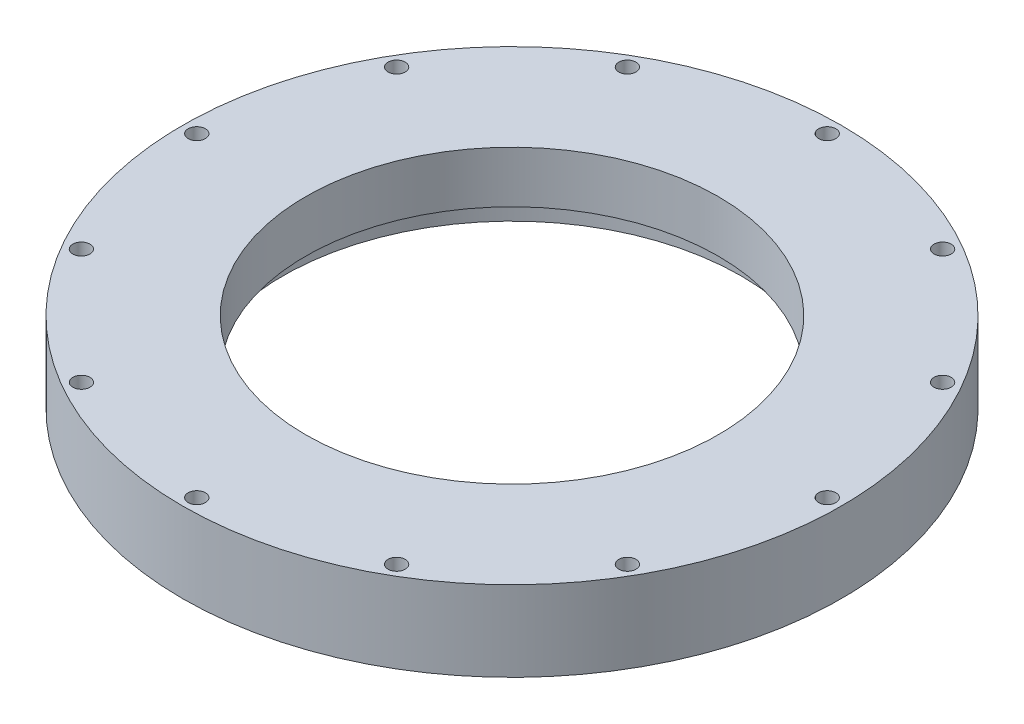
ISO-10303-21;
HEADER;
FILE_DESCRIPTION(('STEP AP214'),'2;1');
FILE_NAME('part.step','',(''),(''),'','','');
FILE_SCHEMA(('AUTOMOTIVE_DESIGN { 1 0 10303 214 1 1 1 1 }'));
ENDSEC;
DATA;
#1=APPLICATION_CONTEXT('core data for automotive mechanical design processes');
#2=APPLICATION_PROTOCOL_DEFINITION('international standard','automotive_design',2000,#1);
#3=PRODUCT_CONTEXT('',#1,'mechanical');
#4=PRODUCT('Part','Part','',(#3));
#5=PRODUCT_RELATED_PRODUCT_CATEGORY('part','',(#4));
#6=PRODUCT_DEFINITION_FORMATION('','',#4);
#7=PRODUCT_DEFINITION_CONTEXT('part definition',#1,'design');
#8=PRODUCT_DEFINITION('design','',#6,#7);
#9=PRODUCT_DEFINITION_SHAPE('','',#8);
#10=(LENGTH_UNIT() NAMED_UNIT(*) SI_UNIT(.MILLI.,.METRE.));
#11=(NAMED_UNIT(*) PLANE_ANGLE_UNIT() SI_UNIT($,.RADIAN.));
#12=(NAMED_UNIT(*) SI_UNIT($,.STERADIAN.) SOLID_ANGLE_UNIT());
#13=UNCERTAINTY_MEASURE_WITH_UNIT(LENGTH_MEASURE(1.E-05),#10,'distance_accuracy_value','');
#14=(GEOMETRIC_REPRESENTATION_CONTEXT(3) GLOBAL_UNCERTAINTY_ASSIGNED_CONTEXT((#13)) GLOBAL_UNIT_ASSIGNED_CONTEXT((#10,
#11,#12)) REPRESENTATION_CONTEXT('',''));
#15=CARTESIAN_POINT('',(0.,0.,0.));
#16=DIRECTION('',(0.,0.,1.));
#17=DIRECTION('',(1.,0.,0.));
#18=AXIS2_PLACEMENT_3D('',#15,#16,#17);
#19=CARTESIAN_POINT('',(0.,14.,0.));
#20=DIRECTION('',(0.,-1.,0.));
#21=DIRECTION('',(0.,0.,-1.));
#22=AXIS2_PLACEMENT_3D('',#19,#20,#21);
#23=CYLINDRICAL_SURFACE('',#22,40.);
#24=CARTESIAN_POINT('',(0.,0.,0.));
#25=DIRECTION('',(0.,1.,0.));
#26=DIRECTION('',(0.,0.,1.));
#27=AXIS2_PLACEMENT_3D('',#24,#25,#26);
#28=CIRCLE('',#27,40.);
#29=CARTESIAN_POINT('',(0.,0.,40.));
#30=VERTEX_POINT('',#29);
#31=EDGE_CURVE('E46',#30,#30,#28,.T.);
#32=ORIENTED_EDGE('',*,*,#31,.F.);
#33=EDGE_LOOP('',(#32));
#34=FACE_BOUND('',#33,.T.);
#35=CARTESIAN_POINT('',(0.,5.,0.));
#36=DIRECTION('',(0.,1.,0.));
#37=DIRECTION('',(0.,0.,1.));
#38=AXIS2_PLACEMENT_3D('',#35,#36,#37);
#39=CIRCLE('',#38,40.);
#40=CARTESIAN_POINT('',(0.,5.,40.));
#41=VERTEX_POINT('',#40);
#42=EDGE_CURVE('E37',#41,#41,#39,.T.);
#43=ORIENTED_EDGE('',*,*,#42,.T.);
#44=EDGE_LOOP('',(#43));
#45=FACE_BOUND('',#44,.T.);
#46=ADVANCED_FACE('F33',(#34,#45),#23,.F.);
#47=CARTESIAN_POINT('',(0.,14.,0.));
#48=DIRECTION('',(0.,1.,0.));
#49=DIRECTION('',(0.,0.,1.));
#50=AXIS2_PLACEMENT_3D('',#47,#48,#49);
#51=PLANE('',#50);
#52=CARTESIAN_POINT('',(-47.631397208143,14.,-27.4999999999979));
#53=DIRECTION('',(0.,1.,0.));
#54=DIRECTION('',(0.,0.,1.));
#55=AXIS2_PLACEMENT_3D('',#52,#53,#54);
#56=CIRCLE('',#55,1.50000000000237);
#57=CARTESIAN_POINT('',(-47.631397208143,14.,-25.9999999999956));
#58=VERTEX_POINT('',#57);
#59=EDGE_CURVE('E108',#58,#58,#56,.T.);
#60=ORIENTED_EDGE('',*,*,#59,.F.);
#61=EDGE_LOOP('',(#60));
#62=FACE_BOUND('',#61,.T.);
#63=CARTESIAN_POINT('',(-47.6313972081406,14.,27.500000000002));
#64=DIRECTION('',(0.,1.,0.));
#65=DIRECTION('',(0.,0.,1.));
#66=AXIS2_PLACEMENT_3D('',#63,#64,#65);
#67=CIRCLE('',#66,1.50000000000445);
#68=CARTESIAN_POINT('',(-47.6313972081406,14.,29.0000000000065));
#69=VERTEX_POINT('',#68);
#70=EDGE_CURVE('E96',#69,#69,#67,.T.);
#71=ORIENTED_EDGE('',*,*,#70,.F.);
#72=EDGE_LOOP('',(#71));
#73=FACE_BOUND('',#72,.T.);
#74=CARTESIAN_POINT('',(4.66937538383073E-12,14.,55.));
#75=DIRECTION('',(0.,1.,0.));
#76=DIRECTION('',(0.,0.,1.));
#77=AXIS2_PLACEMENT_3D('',#74,#75,#76);
#78=CIRCLE('',#77,1.50000000000483);
#79=CARTESIAN_POINT('',(4.66937538383073E-12,14.,56.5000000000048));
#80=VERTEX_POINT('',#79);
#81=EDGE_CURVE('E84',#80,#80,#78,.T.);
#82=ORIENTED_EDGE('',*,*,#81,.F.);
#83=EDGE_LOOP('',(#82));
#84=FACE_BOUND('',#83,.T.);
#85=CARTESIAN_POINT('',(47.6313972081476,14.,27.499999999998));
#86=DIRECTION('',(0.,1.,0.));
#87=DIRECTION('',(0.,0.,1.));
#88=AXIS2_PLACEMENT_3D('',#85,#86,#87);
#89=CIRCLE('',#88,1.50000000000301);
#90=CARTESIAN_POINT('',(47.6313972081476,14.,29.000000000001));
#91=VERTEX_POINT('',#90);
#92=EDGE_CURVE('E72',#91,#91,#89,.T.);
#93=ORIENTED_EDGE('',*,*,#92,.F.);
#94=EDGE_LOOP('',(#93));
#95=FACE_BOUND('',#94,.T.);
#96=CARTESIAN_POINT('',(47.6313972081453,14.,-27.500000000002));
#97=DIRECTION('',(0.,1.,0.));
#98=DIRECTION('',(0.,0.,1.));
#99=AXIS2_PLACEMENT_3D('',#96,#97,#98);
#100=CIRCLE('',#99,1.50000000000065);
#101=CARTESIAN_POINT('',(47.6313972081453,14.,-26.0000000000014));
#102=VERTEX_POINT('',#101);
#103=EDGE_CURVE('E60',#102,#102,#100,.T.);
#104=ORIENTED_EDGE('',*,*,#103,.F.);
#105=EDGE_LOOP('',(#104));
#106=FACE_BOUND('',#105,.T.);
#107=CARTESIAN_POINT('',(0.,14.,-55.));
#108=DIRECTION('',(0.,1.,0.));
#109=DIRECTION('',(0.,0.,1.));
#110=AXIS2_PLACEMENT_3D('',#107,#108,#109);
#111=CIRCLE('',#110,1.5);
#112=CARTESIAN_POINT('',(0.,14.,-53.5));
#113=VERTEX_POINT('',#112);
#114=EDGE_CURVE('E50',#113,#113,#111,.T.);
#115=ORIENTED_EDGE('',*,*,#114,.F.);
#116=EDGE_LOOP('',(#115));
#117=FACE_BOUND('',#116,.T.);
#118=CARTESIAN_POINT('',(0.,14.,0.));
#119=DIRECTION('',(0.,1.,0.));
#120=DIRECTION('',(0.,0.,1.));
#121=AXIS2_PLACEMENT_3D('',#118,#119,#120);
#122=CIRCLE('',#121,57.5);
#123=CARTESIAN_POINT('',(0.,14.,57.5));
#124=VERTEX_POINT('',#123);
#125=EDGE_CURVE('E10',#124,#124,#122,.T.);
#126=ORIENTED_EDGE('',*,*,#125,.T.);
#127=EDGE_LOOP('',(#126));
#128=FACE_BOUND('',#127,.T.);
#129=CARTESIAN_POINT('',(27.5000000000001,14.,-47.6313972081441));
#130=DIRECTION('',(0.,1.,0.));
#131=DIRECTION('',(0.,0.,1.));
#132=AXIS2_PLACEMENT_3D('',#129,#130,#131);
#133=CIRCLE('',#132,1.5);
#134=CARTESIAN_POINT('',(27.5000000000001,14.,-46.1313972081441));
#135=VERTEX_POINT('',#134);
#136=EDGE_CURVE('E54',#135,#135,#133,.T.);
#137=ORIENTED_EDGE('',*,*,#136,.F.);
#138=EDGE_LOOP('',(#137));
#139=FACE_BOUND('',#138,.T.);
#140=CARTESIAN_POINT('',(55.0000000000023,14.,-2.33468769191537E-12));
#141=DIRECTION('',(0.,1.,0.));
#142=DIRECTION('',(0.,0.,1.));
#143=AXIS2_PLACEMENT_3D('',#140,#141,#142);
#144=CIRCLE('',#143,1.50000000000173);
#145=CARTESIAN_POINT('',(55.0000000000023,14.,1.4999999999994));
#146=VERTEX_POINT('',#145);
#147=EDGE_CURVE('E66',#146,#146,#144,.T.);
#148=ORIENTED_EDGE('',*,*,#147,.F.);
#149=EDGE_LOOP('',(#148));
#150=FACE_BOUND('',#149,.T.);
#151=CARTESIAN_POINT('',(27.5000000000044,14.,47.6313972081429));
#152=DIRECTION('',(0.,1.,0.));
#153=DIRECTION('',(0.,0.,1.));
#154=AXIS2_PLACEMENT_3D('',#151,#152,#153);
#155=CIRCLE('',#154,1.50000000000415);
#156=CARTESIAN_POINT('',(27.5000000000044,14.,49.1313972081471));
#157=VERTEX_POINT('',#156);
#158=EDGE_CURVE('E78',#157,#157,#155,.T.);
#159=ORIENTED_EDGE('',*,*,#158,.F.);
#160=EDGE_LOOP('',(#159));
#161=FACE_BOUND('',#160,.T.);
#162=CARTESIAN_POINT('',(-27.4999999999956,14.,47.6313972081453));
#163=DIRECTION('',(0.,1.,0.));
#164=DIRECTION('',(0.,0.,1.));
#165=AXIS2_PLACEMENT_3D('',#162,#163,#164);
#166=CIRCLE('',#165,1.50000000000495);
#167=CARTESIAN_POINT('',(-27.4999999999956,14.,49.1313972081502));
#168=VERTEX_POINT('',#167);
#169=EDGE_CURVE('E90',#168,#168,#166,.T.);
#170=ORIENTED_EDGE('',*,*,#169,.F.);
#171=EDGE_LOOP('',(#170));
#172=FACE_BOUND('',#171,.T.);
#173=CARTESIAN_POINT('',(-54.9999999999977,14.,2.34142324931068E-12));
#174=DIRECTION('',(0.,1.,0.));
#175=DIRECTION('',(0.,0.,1.));
#176=AXIS2_PLACEMENT_3D('',#173,#174,#175);
#177=CIRCLE('',#176,1.50000000000347);
#178=CARTESIAN_POINT('',(-54.9999999999977,14.,1.50000000000581));
#179=VERTEX_POINT('',#178);
#180=EDGE_CURVE('E102',#179,#179,#177,.T.);
#181=ORIENTED_EDGE('',*,*,#180,.F.);
#182=EDGE_LOOP('',(#181));
#183=FACE_BOUND('',#182,.T.);
#184=CARTESIAN_POINT('',(-27.4999999999997,14.,-47.6313972081429));
#185=DIRECTION('',(0.,1.,0.));
#186=DIRECTION('',(0.,0.,1.));
#187=AXIS2_PLACEMENT_3D('',#184,#185,#186);
#188=CIRCLE('',#187,1.50000000000134);
#189=CARTESIAN_POINT('',(-27.4999999999997,14.,-46.1313972081416));
#190=VERTEX_POINT('',#189);
#191=EDGE_CURVE('E114',#190,#190,#188,.T.);
#192=ORIENTED_EDGE('',*,*,#191,.F.);
#193=EDGE_LOOP('',(#192));
#194=FACE_BOUND('',#193,.T.);
#195=CARTESIAN_POINT('',(0.,14.,0.));
#196=DIRECTION('',(0.,1.,0.));
#197=DIRECTION('',(0.,0.,1.));
#198=AXIS2_PLACEMENT_3D('',#195,#196,#197);
#199=CIRCLE('',#198,36.);
#200=CARTESIAN_POINT('',(0.,14.,36.));
#201=VERTEX_POINT('',#200);
#202=EDGE_CURVE('E122',#201,#201,#199,.T.);
#203=ORIENTED_EDGE('',*,*,#202,.F.);
#204=EDGE_LOOP('',(#203));
#205=FACE_BOUND('',#204,.T.);
#206=ADVANCED_FACE('F207',(#62,#73,#84,#95,#106,#117,#128,#139,#150,#161,#172,#183,#194,#205),
#51,.T.);
#207=CARTESIAN_POINT('',(0.,0.,0.));
#208=DIRECTION('',(0.,1.,0.));
#209=DIRECTION('',(0.,0.,1.));
#210=AXIS2_PLACEMENT_3D('',#207,#208,#209);
#211=PLANE('',#210);
#212=CARTESIAN_POINT('',(0.,0.,45.));
#213=DIRECTION('',(0.,-1.,0.));
#214=DIRECTION('',(0.,0.,-1.));
#215=AXIS2_PLACEMENT_3D('',#212,#213,#214);
#216=CIRCLE('',#215,1.5);
#217=CARTESIAN_POINT('',(0.,0.,43.5));
#218=VERTEX_POINT('',#217);
#219=EDGE_CURVE('E178',#218,#218,#216,.T.);
#220=ORIENTED_EDGE('',*,*,#219,.F.);
#221=EDGE_LOOP('',(#220));
#222=FACE_BOUND('',#221,.T.);
#223=CARTESIAN_POINT('',(-24.3288367855016,0.,37.8564089774021));
#224=DIRECTION('',(0.,-1.,0.));
#225=DIRECTION('',(0.,0.,-1.));
#226=AXIS2_PLACEMENT_3D('',#223,#224,#225);
#227=CIRCLE('',#226,1.50000000000117);
#228=CARTESIAN_POINT('',(-24.3288367855016,0.,36.356408977401));
#229=VERTEX_POINT('',#228);
#230=EDGE_CURVE('E179',#229,#229,#227,.T.);
#231=ORIENTED_EDGE('',*,*,#230,.F.);
#232=EDGE_LOOP('',(#231));
#233=FACE_BOUND('',#232,.T.);
#234=CARTESIAN_POINT('',(-40.9334397909522,0.,18.6936755850831));
#235=DIRECTION('',(0.,-1.,0.));
#236=DIRECTION('',(0.,0.,-1.));
#237=AXIS2_PLACEMENT_3D('',#234,#235,#236);
#238=CIRCLE('',#237,1.50000000000211);
#239=CARTESIAN_POINT('',(-40.9334397909522,0.,17.193675585081));
#240=VERTEX_POINT('',#239);
#241=EDGE_CURVE('E185',#240,#240,#238,.T.);
#242=ORIENTED_EDGE('',*,*,#241,.F.);
#243=EDGE_LOOP('',(#242));
#244=FACE_BOUND('',#243,.T.);
#245=CARTESIAN_POINT('',(-44.5419648846398,0.,-6.40416772229972));
#246=DIRECTION('',(0.,-1.,0.));
#247=DIRECTION('',(0.,0.,-1.));
#248=AXIS2_PLACEMENT_3D('',#245,#246,#247);
#249=CIRCLE('',#248,1.50000000000309);
#250=CARTESIAN_POINT('',(-44.5419648846398,0.,-7.90416772230282));
#251=VERTEX_POINT('',#250);
#252=EDGE_CURVE('E129',#251,#251,#249,.T.);
#253=ORIENTED_EDGE('',*,*,#252,.F.);
#254=EDGE_LOOP('',(#253));
#255=FACE_BOUND('',#254,.T.);
#256=CARTESIAN_POINT('',(-34.0087308459385,0.,-29.4687330275393));
#257=DIRECTION('',(0.,-1.,0.));
#258=DIRECTION('',(0.,0.,-1.));
#259=AXIS2_PLACEMENT_3D('',#256,#257,#258);
#260=CIRCLE('',#259,1.50000000000384);
#261=CARTESIAN_POINT('',(-34.0087308459385,0.,-30.9687330275431));
#262=VERTEX_POINT('',#261);
#263=EDGE_CURVE('E136',#262,#262,#260,.T.);
#264=ORIENTED_EDGE('',*,*,#263,.F.);
#265=EDGE_LOOP('',(#264));
#266=FACE_BOUND('',#265,.T.);
#267=CARTESIAN_POINT('',(-12.6779650578606,0.,-43.1771838126529));
#268=DIRECTION('',(0.,-1.,0.));
#269=DIRECTION('',(0.,0.,-1.));
#270=AXIS2_PLACEMENT_3D('',#267,#268,#269);
#271=CIRCLE('',#270,1.50000000000408);
#272=CARTESIAN_POINT('',(-12.6779650578606,0.,-44.677183812657));
#273=VERTEX_POINT('',#272);
#274=EDGE_CURVE('E142',#273,#273,#271,.T.);
#275=ORIENTED_EDGE('',*,*,#274,.F.);
#276=EDGE_LOOP('',(#275));
#277=FACE_BOUND('',#276,.T.);
#278=CARTESIAN_POINT('',(12.6779650578681,0.,-43.1771838126518));
#279=DIRECTION('',(0.,-1.,0.));
#280=DIRECTION('',(0.,0.,-1.));
#281=AXIS2_PLACEMENT_3D('',#278,#279,#280);
#282=CIRCLE('',#281,1.50000000000371);
#283=CARTESIAN_POINT('',(12.6779650578681,0.,-44.6771838126556));
#284=VERTEX_POINT('',#283);
#285=EDGE_CURVE('E148',#284,#284,#282,.T.);
#286=ORIENTED_EDGE('',*,*,#285,.F.);
#287=EDGE_LOOP('',(#286));
#288=FACE_BOUND('',#287,.T.);
#289=CARTESIAN_POINT('',(34.0087308459448,0.,-29.4687330275364));
#290=DIRECTION('',(0.,-1.,0.));
#291=DIRECTION('',(0.,0.,-1.));
#292=AXIS2_PLACEMENT_3D('',#289,#290,#291);
#293=CIRCLE('',#292,1.50000000000283);
#294=CARTESIAN_POINT('',(34.0087308459448,0.,-30.9687330275392));
#295=VERTEX_POINT('',#294);
#296=EDGE_CURVE('E154',#295,#295,#293,.T.);
#297=ORIENTED_EDGE('',*,*,#296,.F.);
#298=EDGE_LOOP('',(#297));
#299=FACE_BOUND('',#298,.T.);
#300=CARTESIAN_POINT('',(44.5419648846442,0.,-6.40416772229594));
#301=DIRECTION('',(0.,-1.,0.));
#302=DIRECTION('',(0.,0.,-1.));
#303=AXIS2_PLACEMENT_3D('',#300,#301,#302);
#304=CIRCLE('',#303,1.5000000000017);
#305=CARTESIAN_POINT('',(44.5419648846442,0.,-7.90416772229764));
#306=VERTEX_POINT('',#305);
#307=EDGE_CURVE('E160',#306,#306,#304,.T.);
#308=ORIENTED_EDGE('',*,*,#307,.F.);
#309=EDGE_LOOP('',(#308));
#310=FACE_BOUND('',#309,.T.);
#311=CARTESIAN_POINT('',(40.9334397909544,0.,18.6936755850866));
#312=DIRECTION('',(0.,-1.,0.));
#313=DIRECTION('',(0.,0.,-1.));
#314=AXIS2_PLACEMENT_3D('',#311,#312,#313);
#315=CIRCLE('',#314,1.50000000000067);
#316=CARTESIAN_POINT('',(40.9334397909544,0.,17.193675585086));
#317=VERTEX_POINT('',#316);
#318=EDGE_CURVE('E166',#317,#317,#315,.T.);
#319=ORIENTED_EDGE('',*,*,#318,.F.);
#320=EDGE_LOOP('',(#319));
#321=FACE_BOUND('',#320,.T.);
#322=CARTESIAN_POINT('',(24.3288367855022,0.,37.8564089774042));
#323=DIRECTION('',(0.,-1.,0.));
#324=DIRECTION('',(0.,0.,-1.));
#325=AXIS2_PLACEMENT_3D('',#322,#323,#324);
#326=CIRCLE('',#325,1.50000000000003);
#327=CARTESIAN_POINT('',(24.3288367855022,0.,36.3564089774042));
#328=VERTEX_POINT('',#327);
#329=EDGE_CURVE('E172',#328,#328,#326,.T.);
#330=ORIENTED_EDGE('',*,*,#329,.F.);
#331=EDGE_LOOP('',(#330));
#332=FACE_BOUND('',#331,.T.);
#333=CARTESIAN_POINT('',(0.,0.,0.));
#334=DIRECTION('',(0.,1.,0.));
#335=DIRECTION('',(0.,0.,1.));
#336=AXIS2_PLACEMENT_3D('',#333,#334,#335);
#337=CIRCLE('',#336,57.5);
#338=CARTESIAN_POINT('',(0.,0.,57.5));
#339=VERTEX_POINT('',#338);
#340=EDGE_CURVE('E41',#339,#339,#337,.T.);
#341=ORIENTED_EDGE('',*,*,#340,.F.);
#342=EDGE_LOOP('',(#341));
#343=FACE_BOUND('',#342,.T.);
#344=ORIENTED_EDGE('',*,*,#31,.T.);
#345=EDGE_LOOP('',(#344));
#346=FACE_BOUND('',#345,.T.);
#347=CARTESIAN_POINT('',(0.,0.,-55.));
#348=DIRECTION('',(0.,1.,0.));
#349=DIRECTION('',(0.,0.,1.));
#350=AXIS2_PLACEMENT_3D('',#347,#348,#349);
#351=CIRCLE('',#350,1.5);
#352=CARTESIAN_POINT('',(0.,0.,-53.5));
#353=VERTEX_POINT('',#352);
#354=EDGE_CURVE('E51',#353,#353,#351,.T.);
#355=ORIENTED_EDGE('',*,*,#354,.T.);
#356=EDGE_LOOP('',(#355));
#357=FACE_BOUND('',#356,.T.);
#358=CARTESIAN_POINT('',(27.5000000000001,0.,-47.6313972081441));
#359=DIRECTION('',(0.,1.,0.));
#360=DIRECTION('',(0.,0.,1.));
#361=AXIS2_PLACEMENT_3D('',#358,#359,#360);
#362=CIRCLE('',#361,1.5);
#363=CARTESIAN_POINT('',(27.5000000000001,0.,-46.1313972081441));
#364=VERTEX_POINT('',#363);
#365=EDGE_CURVE('E57',#364,#364,#362,.T.);
#366=ORIENTED_EDGE('',*,*,#365,.T.);
#367=EDGE_LOOP('',(#366));
#368=FACE_BOUND('',#367,.T.);
#369=CARTESIAN_POINT('',(47.6313972081453,0.,-27.500000000002));
#370=DIRECTION('',(0.,1.,0.));
#371=DIRECTION('',(0.,0.,1.));
#372=AXIS2_PLACEMENT_3D('',#369,#370,#371);
#373=CIRCLE('',#372,1.50000000000065);
#374=CARTESIAN_POINT('',(47.6313972081453,0.,-26.0000000000014));
#375=VERTEX_POINT('',#374);
#376=EDGE_CURVE('E63',#375,#375,#373,.T.);
#377=ORIENTED_EDGE('',*,*,#376,.T.);
#378=EDGE_LOOP('',(#377));
#379=FACE_BOUND('',#378,.T.);
#380=CARTESIAN_POINT('',(55.0000000000023,0.,-2.33468769191537E-12));
#381=DIRECTION('',(0.,1.,0.));
#382=DIRECTION('',(0.,0.,1.));
#383=AXIS2_PLACEMENT_3D('',#380,#381,#382);
#384=CIRCLE('',#383,1.50000000000173);
#385=CARTESIAN_POINT('',(55.0000000000023,0.,1.4999999999994));
#386=VERTEX_POINT('',#385);
#387=EDGE_CURVE('E69',#386,#386,#384,.T.);
#388=ORIENTED_EDGE('',*,*,#387,.T.);
#389=EDGE_LOOP('',(#388));
#390=FACE_BOUND('',#389,.T.);
#391=CARTESIAN_POINT('',(47.6313972081476,0.,27.499999999998));
#392=DIRECTION('',(0.,1.,0.));
#393=DIRECTION('',(0.,0.,1.));
#394=AXIS2_PLACEMENT_3D('',#391,#392,#393);
#395=CIRCLE('',#394,1.50000000000301);
#396=CARTESIAN_POINT('',(47.6313972081476,0.,29.000000000001));
#397=VERTEX_POINT('',#396);
#398=EDGE_CURVE('E75',#397,#397,#395,.T.);
#399=ORIENTED_EDGE('',*,*,#398,.T.);
#400=EDGE_LOOP('',(#399));
#401=FACE_BOUND('',#400,.T.);
#402=CARTESIAN_POINT('',(27.5000000000044,0.,47.6313972081429));
#403=DIRECTION('',(0.,1.,0.));
#404=DIRECTION('',(0.,0.,1.));
#405=AXIS2_PLACEMENT_3D('',#402,#403,#404);
#406=CIRCLE('',#405,1.50000000000415);
#407=CARTESIAN_POINT('',(27.5000000000044,0.,49.1313972081471));
#408=VERTEX_POINT('',#407);
#409=EDGE_CURVE('E81',#408,#408,#406,.T.);
#410=ORIENTED_EDGE('',*,*,#409,.T.);
#411=EDGE_LOOP('',(#410));
#412=FACE_BOUND('',#411,.T.);
#413=CARTESIAN_POINT('',(4.66937538383073E-12,0.,55.));
#414=DIRECTION('',(0.,1.,0.));
#415=DIRECTION('',(0.,0.,1.));
#416=AXIS2_PLACEMENT_3D('',#413,#414,#415);
#417=CIRCLE('',#416,1.50000000000483);
#418=CARTESIAN_POINT('',(4.66937538383073E-12,0.,56.5000000000048));
#419=VERTEX_POINT('',#418);
#420=EDGE_CURVE('E87',#419,#419,#417,.T.);
#421=ORIENTED_EDGE('',*,*,#420,.T.);
#422=EDGE_LOOP('',(#421));
#423=FACE_BOUND('',#422,.T.);
#424=CARTESIAN_POINT('',(-27.4999999999956,0.,47.6313972081453));
#425=DIRECTION('',(0.,1.,0.));
#426=DIRECTION('',(0.,0.,1.));
#427=AXIS2_PLACEMENT_3D('',#424,#425,#426);
#428=CIRCLE('',#427,1.50000000000495);
#429=CARTESIAN_POINT('',(-27.4999999999956,0.,49.1313972081502));
#430=VERTEX_POINT('',#429);
#431=EDGE_CURVE('E93',#430,#430,#428,.T.);
#432=ORIENTED_EDGE('',*,*,#431,.T.);
#433=EDGE_LOOP('',(#432));
#434=FACE_BOUND('',#433,.T.);
#435=CARTESIAN_POINT('',(-47.6313972081406,0.,27.500000000002));
#436=DIRECTION('',(0.,1.,0.));
#437=DIRECTION('',(0.,0.,1.));
#438=AXIS2_PLACEMENT_3D('',#435,#436,#437);
#439=CIRCLE('',#438,1.50000000000445);
#440=CARTESIAN_POINT('',(-47.6313972081406,0.,29.0000000000065));
#441=VERTEX_POINT('',#440);
#442=EDGE_CURVE('E99',#441,#441,#439,.T.);
#443=ORIENTED_EDGE('',*,*,#442,.T.);
#444=EDGE_LOOP('',(#443));
#445=FACE_BOUND('',#444,.T.);
#446=CARTESIAN_POINT('',(-54.9999999999977,0.,2.34142324931068E-12));
#447=DIRECTION('',(0.,1.,0.));
#448=DIRECTION('',(0.,0.,1.));
#449=AXIS2_PLACEMENT_3D('',#446,#447,#448);
#450=CIRCLE('',#449,1.50000000000347);
#451=CARTESIAN_POINT('',(-54.9999999999977,0.,1.50000000000581));
#452=VERTEX_POINT('',#451);
#453=EDGE_CURVE('E105',#452,#452,#450,.T.);
#454=ORIENTED_EDGE('',*,*,#453,.T.);
#455=EDGE_LOOP('',(#454));
#456=FACE_BOUND('',#455,.T.);
#457=CARTESIAN_POINT('',(-47.631397208143,0.,-27.4999999999979));
#458=DIRECTION('',(0.,1.,0.));
#459=DIRECTION('',(0.,0.,1.));
#460=AXIS2_PLACEMENT_3D('',#457,#458,#459);
#461=CIRCLE('',#460,1.50000000000237);
#462=CARTESIAN_POINT('',(-47.631397208143,0.,-25.9999999999956));
#463=VERTEX_POINT('',#462);
#464=EDGE_CURVE('E111',#463,#463,#461,.T.);
#465=ORIENTED_EDGE('',*,*,#464,.T.);
#466=EDGE_LOOP('',(#465));
#467=FACE_BOUND('',#466,.T.);
#468=CARTESIAN_POINT('',(-27.4999999999997,0.,-47.6313972081429));
#469=DIRECTION('',(0.,1.,0.));
#470=DIRECTION('',(0.,0.,1.));
#471=AXIS2_PLACEMENT_3D('',#468,#469,#470);
#472=CIRCLE('',#471,1.50000000000134);
#473=CARTESIAN_POINT('',(-27.4999999999997,0.,-46.1313972081416));
#474=VERTEX_POINT('',#473);
#475=EDGE_CURVE('E117',#474,#474,#472,.T.);
#476=ORIENTED_EDGE('',*,*,#475,.T.);
#477=EDGE_LOOP('',(#476));
#478=FACE_BOUND('',#477,.T.);
#479=ADVANCED_FACE('F204',(#222,#233,#244,#255,#266,#277,#288,#299,#310,#321,#332,#343,#346,
#357,#368,#379,#390,#401,#412,#423,#434,#445,#456,#467,#478),#211,.F.);
#480=CARTESIAN_POINT('',(0.,14.,0.));
#481=DIRECTION('',(0.,-1.,0.));
#482=DIRECTION('',(0.,0.,-1.));
#483=AXIS2_PLACEMENT_3D('',#480,#481,#482);
#484=CYLINDRICAL_SURFACE('',#483,57.5);
#485=ORIENTED_EDGE('',*,*,#125,.F.);
#486=EDGE_LOOP('',(#485));
#487=FACE_BOUND('',#486,.T.);
#488=ORIENTED_EDGE('',*,*,#340,.T.);
#489=EDGE_LOOP('',(#488));
#490=FACE_BOUND('',#489,.T.);
#491=ADVANCED_FACE('F35',(#487,#490),#484,.T.);
#492=CARTESIAN_POINT('',(0.,14.,-55.));
#493=DIRECTION('',(0.,-1.,0.));
#494=DIRECTION('',(0.,0.,-1.));
#495=AXIS2_PLACEMENT_3D('',#492,#493,#494);
#496=CYLINDRICAL_SURFACE('',#495,1.5);
#497=ORIENTED_EDGE('',*,*,#114,.T.);
#498=EDGE_LOOP('',(#497));
#499=FACE_BOUND('',#498,.T.);
#500=ORIENTED_EDGE('',*,*,#354,.F.);
#501=EDGE_LOOP('',(#500));
#502=FACE_BOUND('',#501,.T.);
#503=ADVANCED_FACE('F282',(#499,#502),#496,.F.);
#504=CARTESIAN_POINT('',(27.5000000000001,14.,-47.6313972081441));
#505=DIRECTION('',(0.,-1.,0.));
#506=DIRECTION('',(0.,0.,-1.));
#507=AXIS2_PLACEMENT_3D('',#504,#505,#506);
#508=CYLINDRICAL_SURFACE('',#507,1.5);
#509=ORIENTED_EDGE('',*,*,#136,.T.);
#510=EDGE_LOOP('',(#509));
#511=FACE_BOUND('',#510,.T.);
#512=ORIENTED_EDGE('',*,*,#365,.F.);
#513=EDGE_LOOP('',(#512));
#514=FACE_BOUND('',#513,.T.);
#515=ADVANCED_FACE('F285',(#511,#514),#508,.F.);
#516=CARTESIAN_POINT('',(47.6313972081453,14.,-27.500000000002));
#517=DIRECTION('',(0.,-1.,0.));
#518=DIRECTION('',(0.,0.,-1.));
#519=AXIS2_PLACEMENT_3D('',#516,#517,#518);
#520=CYLINDRICAL_SURFACE('',#519,1.50000000000065);
#521=ORIENTED_EDGE('',*,*,#103,.T.);
#522=EDGE_LOOP('',(#521));
#523=FACE_BOUND('',#522,.T.);
#524=ORIENTED_EDGE('',*,*,#376,.F.);
#525=EDGE_LOOP('',(#524));
#526=FACE_BOUND('',#525,.T.);
#527=ADVANCED_FACE('F289',(#523,#526),#520,.F.);
#528=CARTESIAN_POINT('',(55.0000000000023,14.,-2.33468769191537E-12));
#529=DIRECTION('',(0.,-1.,0.));
#530=DIRECTION('',(0.,0.,-1.));
#531=AXIS2_PLACEMENT_3D('',#528,#529,#530);
#532=CYLINDRICAL_SURFACE('',#531,1.50000000000173);
#533=ORIENTED_EDGE('',*,*,#147,.T.);
#534=EDGE_LOOP('',(#533));
#535=FACE_BOUND('',#534,.T.);
#536=ORIENTED_EDGE('',*,*,#387,.F.);
#537=EDGE_LOOP('',(#536));
#538=FACE_BOUND('',#537,.T.);
#539=ADVANCED_FACE('F293',(#535,#538),#532,.F.);
#540=CARTESIAN_POINT('',(47.6313972081476,14.,27.499999999998));
#541=DIRECTION('',(0.,-1.,0.));
#542=DIRECTION('',(0.,0.,-1.));
#543=AXIS2_PLACEMENT_3D('',#540,#541,#542);
#544=CYLINDRICAL_SURFACE('',#543,1.50000000000301);
#545=ORIENTED_EDGE('',*,*,#92,.T.);
#546=EDGE_LOOP('',(#545));
#547=FACE_BOUND('',#546,.T.);
#548=ORIENTED_EDGE('',*,*,#398,.F.);
#549=EDGE_LOOP('',(#548));
#550=FACE_BOUND('',#549,.T.);
#551=ADVANCED_FACE('F297',(#547,#550),#544,.F.);
#552=CARTESIAN_POINT('',(27.5000000000044,14.,47.6313972081429));
#553=DIRECTION('',(0.,-1.,0.));
#554=DIRECTION('',(0.,0.,-1.));
#555=AXIS2_PLACEMENT_3D('',#552,#553,#554);
#556=CYLINDRICAL_SURFACE('',#555,1.50000000000415);
#557=ORIENTED_EDGE('',*,*,#158,.T.);
#558=EDGE_LOOP('',(#557));
#559=FACE_BOUND('',#558,.T.);
#560=ORIENTED_EDGE('',*,*,#409,.F.);
#561=EDGE_LOOP('',(#560));
#562=FACE_BOUND('',#561,.T.);
#563=ADVANCED_FACE('F301',(#559,#562),#556,.F.);
#564=CARTESIAN_POINT('',(4.66937538383073E-12,14.,55.));
#565=DIRECTION('',(0.,-1.,0.));
#566=DIRECTION('',(0.,0.,-1.));
#567=AXIS2_PLACEMENT_3D('',#564,#565,#566);
#568=CYLINDRICAL_SURFACE('',#567,1.50000000000483);
#569=ORIENTED_EDGE('',*,*,#81,.T.);
#570=EDGE_LOOP('',(#569));
#571=FACE_BOUND('',#570,.T.);
#572=ORIENTED_EDGE('',*,*,#420,.F.);
#573=EDGE_LOOP('',(#572));
#574=FACE_BOUND('',#573,.T.);
#575=ADVANCED_FACE('F305',(#571,#574),#568,.F.);
#576=CARTESIAN_POINT('',(-27.4999999999956,14.,47.6313972081453));
#577=DIRECTION('',(0.,-1.,0.));
#578=DIRECTION('',(0.,0.,-1.));
#579=AXIS2_PLACEMENT_3D('',#576,#577,#578);
#580=CYLINDRICAL_SURFACE('',#579,1.50000000000495);
#581=ORIENTED_EDGE('',*,*,#169,.T.);
#582=EDGE_LOOP('',(#581));
#583=FACE_BOUND('',#582,.T.);
#584=ORIENTED_EDGE('',*,*,#431,.F.);
#585=EDGE_LOOP('',(#584));
#586=FACE_BOUND('',#585,.T.);
#587=ADVANCED_FACE('F309',(#583,#586),#580,.F.);
#588=CARTESIAN_POINT('',(-47.6313972081406,14.,27.500000000002));
#589=DIRECTION('',(0.,-1.,0.));
#590=DIRECTION('',(0.,0.,-1.));
#591=AXIS2_PLACEMENT_3D('',#588,#589,#590);
#592=CYLINDRICAL_SURFACE('',#591,1.50000000000445);
#593=ORIENTED_EDGE('',*,*,#70,.T.);
#594=EDGE_LOOP('',(#593));
#595=FACE_BOUND('',#594,.T.);
#596=ORIENTED_EDGE('',*,*,#442,.F.);
#597=EDGE_LOOP('',(#596));
#598=FACE_BOUND('',#597,.T.);
#599=ADVANCED_FACE('F313',(#595,#598),#592,.F.);
#600=CARTESIAN_POINT('',(-54.9999999999977,14.,2.34142324931068E-12));
#601=DIRECTION('',(0.,-1.,0.));
#602=DIRECTION('',(0.,0.,-1.));
#603=AXIS2_PLACEMENT_3D('',#600,#601,#602);
#604=CYLINDRICAL_SURFACE('',#603,1.50000000000347);
#605=ORIENTED_EDGE('',*,*,#180,.T.);
#606=EDGE_LOOP('',(#605));
#607=FACE_BOUND('',#606,.T.);
#608=ORIENTED_EDGE('',*,*,#453,.F.);
#609=EDGE_LOOP('',(#608));
#610=FACE_BOUND('',#609,.T.);
#611=ADVANCED_FACE('F269',(#607,#610),#604,.F.);
#612=CARTESIAN_POINT('',(-47.631397208143,14.,-27.4999999999979));
#613=DIRECTION('',(0.,-1.,0.));
#614=DIRECTION('',(0.,0.,-1.));
#615=AXIS2_PLACEMENT_3D('',#612,#613,#614);
#616=CYLINDRICAL_SURFACE('',#615,1.50000000000237);
#617=ORIENTED_EDGE('',*,*,#59,.T.);
#618=EDGE_LOOP('',(#617));
#619=FACE_BOUND('',#618,.T.);
#620=ORIENTED_EDGE('',*,*,#464,.F.);
#621=EDGE_LOOP('',(#620));
#622=FACE_BOUND('',#621,.T.);
#623=ADVANCED_FACE('F259',(#619,#622),#616,.F.);
#624=CARTESIAN_POINT('',(-27.4999999999997,14.,-47.6313972081429));
#625=DIRECTION('',(0.,-1.,0.));
#626=DIRECTION('',(0.,0.,-1.));
#627=AXIS2_PLACEMENT_3D('',#624,#625,#626);
#628=CYLINDRICAL_SURFACE('',#627,1.50000000000134);
#629=ORIENTED_EDGE('',*,*,#191,.T.);
#630=EDGE_LOOP('',(#629));
#631=FACE_BOUND('',#630,.T.);
#632=ORIENTED_EDGE('',*,*,#475,.F.);
#633=EDGE_LOOP('',(#632));
#634=FACE_BOUND('',#633,.T.);
#635=ADVANCED_FACE('F256',(#631,#634),#628,.F.);
#636=CARTESIAN_POINT('',(0.,5.,0.));
#637=DIRECTION('',(0.,1.,0.));
#638=DIRECTION('',(0.,0.,1.));
#639=AXIS2_PLACEMENT_3D('',#636,#637,#638);
#640=PLANE('',#639);
#641=CARTESIAN_POINT('',(0.,5.,0.));
#642=DIRECTION('',(0.,1.,0.));
#643=DIRECTION('',(0.,0.,1.));
#644=AXIS2_PLACEMENT_3D('',#641,#642,#643);
#645=CIRCLE('',#644,36.);
#646=CARTESIAN_POINT('',(0.,5.,36.));
#647=VERTEX_POINT('',#646);
#648=EDGE_CURVE('E125',#647,#647,#645,.T.);
#649=ORIENTED_EDGE('',*,*,#648,.T.);
#650=EDGE_LOOP('',(#649));
#651=FACE_BOUND('',#650,.T.);
#652=ORIENTED_EDGE('',*,*,#42,.F.);
#653=EDGE_LOOP('',(#652));
#654=FACE_BOUND('',#653,.T.);
#655=ADVANCED_FACE('F258',(#651,#654),#640,.F.);
#656=CARTESIAN_POINT('',(0.,5.,0.));
#657=DIRECTION('',(0.,1.,0.));
#658=DIRECTION('',(0.,0.,1.));
#659=AXIS2_PLACEMENT_3D('',#656,#657,#658);
#660=CYLINDRICAL_SURFACE('',#659,36.);
#661=ORIENTED_EDGE('',*,*,#648,.F.);
#662=EDGE_LOOP('',(#661));
#663=FACE_BOUND('',#662,.T.);
#664=ORIENTED_EDGE('',*,*,#202,.T.);
#665=EDGE_LOOP('',(#664));
#666=FACE_BOUND('',#665,.T.);
#667=ADVANCED_FACE('F266',(#663,#666),#660,.F.);
#668=CARTESIAN_POINT('',(24.3288367855022,5.,37.8564089774042));
#669=DIRECTION('',(0.,-1.,0.));
#670=DIRECTION('',(0.,0.,-1.));
#671=AXIS2_PLACEMENT_3D('',#668,#669,#670);
#672=CYLINDRICAL_SURFACE('',#671,1.50000000000003);
#673=CARTESIAN_POINT('',(24.3288367855022,5.,37.8564089774042));
#674=DIRECTION('',(0.,-1.,0.));
#675=DIRECTION('',(0.,0.,-1.));
#676=AXIS2_PLACEMENT_3D('',#673,#674,#675);
#677=CIRCLE('',#676,1.50000000000003);
#678=CARTESIAN_POINT('',(24.3288367855022,5.,36.3564089774042));
#679=VERTEX_POINT('',#678);
#680=EDGE_CURVE('E175',#679,#679,#677,.T.);
#681=ORIENTED_EDGE('',*,*,#680,.F.);
#682=EDGE_LOOP('',(#681));
#683=FACE_BOUND('',#682,.T.);
#684=ORIENTED_EDGE('',*,*,#329,.T.);
#685=EDGE_LOOP('',(#684));
#686=FACE_BOUND('',#685,.T.);
#687=ADVANCED_FACE('F331',(#683,#686),#672,.F.);
#688=CARTESIAN_POINT('',(24.3288367855022,5.,37.8564089774042));
#689=DIRECTION('',(0.,-1.,0.));
#690=DIRECTION('',(0.,0.,-1.));
#691=AXIS2_PLACEMENT_3D('',#688,#689,#690);
#692=PLANE('',#691);
#693=ORIENTED_EDGE('',*,*,#680,.T.);
#694=EDGE_LOOP('',(#693));
#695=FACE_BOUND('',#694,.T.);
#696=ADVANCED_FACE('F337',(#695),#692,.T.);
#697=CARTESIAN_POINT('',(40.9334397909544,5.,18.6936755850866));
#698=DIRECTION('',(0.,-1.,0.));
#699=DIRECTION('',(0.,0.,-1.));
#700=AXIS2_PLACEMENT_3D('',#697,#698,#699);
#701=CYLINDRICAL_SURFACE('',#700,1.50000000000067);
#702=CARTESIAN_POINT('',(40.9334397909544,5.,18.6936755850866));
#703=DIRECTION('',(0.,-1.,0.));
#704=DIRECTION('',(0.,0.,-1.));
#705=AXIS2_PLACEMENT_3D('',#702,#703,#704);
#706=CIRCLE('',#705,1.50000000000067);
#707=CARTESIAN_POINT('',(40.9334397909544,5.,17.193675585086));
#708=VERTEX_POINT('',#707);
#709=EDGE_CURVE('E169',#708,#708,#706,.T.);
#710=ORIENTED_EDGE('',*,*,#709,.F.);
#711=EDGE_LOOP('',(#710));
#712=FACE_BOUND('',#711,.T.);
#713=ORIENTED_EDGE('',*,*,#318,.T.);
#714=EDGE_LOOP('',(#713));
#715=FACE_BOUND('',#714,.T.);
#716=ADVANCED_FACE('F392',(#712,#715),#701,.F.);
#717=CARTESIAN_POINT('',(40.9334397909544,5.,18.6936755850866));
#718=DIRECTION('',(0.,-1.,0.));
#719=DIRECTION('',(0.,0.,-1.));
#720=AXIS2_PLACEMENT_3D('',#717,#718,#719);
#721=PLANE('',#720);
#722=ORIENTED_EDGE('',*,*,#709,.T.);
#723=EDGE_LOOP('',(#722));
#724=FACE_BOUND('',#723,.T.);
#725=ADVANCED_FACE('F387',(#724),#721,.T.);
#726=CARTESIAN_POINT('',(44.5419648846442,5.,-6.40416772229594));
#727=DIRECTION('',(0.,-1.,0.));
#728=DIRECTION('',(0.,0.,-1.));
#729=AXIS2_PLACEMENT_3D('',#726,#727,#728);
#730=CYLINDRICAL_SURFACE('',#729,1.5000000000017);
#731=CARTESIAN_POINT('',(44.5419648846442,5.,-6.40416772229594));
#732=DIRECTION('',(0.,-1.,0.));
#733=DIRECTION('',(0.,0.,-1.));
#734=AXIS2_PLACEMENT_3D('',#731,#732,#733);
#735=CIRCLE('',#734,1.5000000000017);
#736=CARTESIAN_POINT('',(44.5419648846442,5.,-7.90416772229764));
#737=VERTEX_POINT('',#736);
#738=EDGE_CURVE('E163',#737,#737,#735,.T.);
#739=ORIENTED_EDGE('',*,*,#738,.F.);
#740=EDGE_LOOP('',(#739));
#741=FACE_BOUND('',#740,.T.);
#742=ORIENTED_EDGE('',*,*,#307,.T.);
#743=EDGE_LOOP('',(#742));
#744=FACE_BOUND('',#743,.T.);
#745=ADVANCED_FACE('F384',(#741,#744),#730,.F.);
#746=CARTESIAN_POINT('',(44.5419648846442,5.,-6.40416772229594));
#747=DIRECTION('',(0.,-1.,0.));
#748=DIRECTION('',(0.,0.,-1.));
#749=AXIS2_PLACEMENT_3D('',#746,#747,#748);
#750=PLANE('',#749);
#751=ORIENTED_EDGE('',*,*,#738,.T.);
#752=EDGE_LOOP('',(#751));
#753=FACE_BOUND('',#752,.T.);
#754=ADVANCED_FACE('F379',(#753),#750,.T.);
#755=CARTESIAN_POINT('',(34.0087308459448,5.,-29.4687330275364));
#756=DIRECTION('',(0.,-1.,0.));
#757=DIRECTION('',(0.,0.,-1.));
#758=AXIS2_PLACEMENT_3D('',#755,#756,#757);
#759=CYLINDRICAL_SURFACE('',#758,1.50000000000283);
#760=CARTESIAN_POINT('',(34.0087308459448,5.,-29.4687330275364));
#761=DIRECTION('',(0.,-1.,0.));
#762=DIRECTION('',(0.,0.,-1.));
#763=AXIS2_PLACEMENT_3D('',#760,#761,#762);
#764=CIRCLE('',#763,1.50000000000283);
#765=CARTESIAN_POINT('',(34.0087308459448,5.,-30.9687330275392));
#766=VERTEX_POINT('',#765);
#767=EDGE_CURVE('E157',#766,#766,#764,.T.);
#768=ORIENTED_EDGE('',*,*,#767,.F.);
#769=EDGE_LOOP('',(#768));
#770=FACE_BOUND('',#769,.T.);
#771=ORIENTED_EDGE('',*,*,#296,.T.);
#772=EDGE_LOOP('',(#771));
#773=FACE_BOUND('',#772,.T.);
#774=ADVANCED_FACE('F376',(#770,#773),#759,.F.);
#775=CARTESIAN_POINT('',(34.0087308459448,5.,-29.4687330275364));
#776=DIRECTION('',(0.,-1.,0.));
#777=DIRECTION('',(0.,0.,-1.));
#778=AXIS2_PLACEMENT_3D('',#775,#776,#777);
#779=PLANE('',#778);
#780=ORIENTED_EDGE('',*,*,#767,.T.);
#781=EDGE_LOOP('',(#780));
#782=FACE_BOUND('',#781,.T.);
#783=ADVANCED_FACE('F371',(#782),#779,.T.);
#784=CARTESIAN_POINT('',(12.6779650578681,5.,-43.1771838126518));
#785=DIRECTION('',(0.,-1.,0.));
#786=DIRECTION('',(0.,0.,-1.));
#787=AXIS2_PLACEMENT_3D('',#784,#785,#786);
#788=CYLINDRICAL_SURFACE('',#787,1.50000000000371);
#789=CARTESIAN_POINT('',(12.6779650578681,5.,-43.1771838126518));
#790=DIRECTION('',(0.,-1.,0.));
#791=DIRECTION('',(0.,0.,-1.));
#792=AXIS2_PLACEMENT_3D('',#789,#790,#791);
#793=CIRCLE('',#792,1.50000000000371);
#794=CARTESIAN_POINT('',(12.6779650578681,5.,-44.6771838126556));
#795=VERTEX_POINT('',#794);
#796=EDGE_CURVE('E151',#795,#795,#793,.T.);
#797=ORIENTED_EDGE('',*,*,#796,.F.);
#798=EDGE_LOOP('',(#797));
#799=FACE_BOUND('',#798,.T.);
#800=ORIENTED_EDGE('',*,*,#285,.T.);
#801=EDGE_LOOP('',(#800));
#802=FACE_BOUND('',#801,.T.);
#803=ADVANCED_FACE('F368',(#799,#802),#788,.F.);
#804=CARTESIAN_POINT('',(12.6779650578681,5.,-43.1771838126518));
#805=DIRECTION('',(0.,-1.,0.));
#806=DIRECTION('',(0.,0.,-1.));
#807=AXIS2_PLACEMENT_3D('',#804,#805,#806);
#808=PLANE('',#807);
#809=ORIENTED_EDGE('',*,*,#796,.T.);
#810=EDGE_LOOP('',(#809));
#811=FACE_BOUND('',#810,.T.);
#812=ADVANCED_FACE('F363',(#811),#808,.T.);
#813=CARTESIAN_POINT('',(-12.6779650578606,5.,-43.1771838126529));
#814=DIRECTION('',(0.,-1.,0.));
#815=DIRECTION('',(0.,0.,-1.));
#816=AXIS2_PLACEMENT_3D('',#813,#814,#815);
#817=CYLINDRICAL_SURFACE('',#816,1.50000000000408);
#818=CARTESIAN_POINT('',(-12.6779650578606,5.,-43.1771838126529));
#819=DIRECTION('',(0.,-1.,0.));
#820=DIRECTION('',(0.,0.,-1.));
#821=AXIS2_PLACEMENT_3D('',#818,#819,#820);
#822=CIRCLE('',#821,1.50000000000408);
#823=CARTESIAN_POINT('',(-12.6779650578606,5.,-44.677183812657));
#824=VERTEX_POINT('',#823);
#825=EDGE_CURVE('E145',#824,#824,#822,.T.);
#826=ORIENTED_EDGE('',*,*,#825,.F.);
#827=EDGE_LOOP('',(#826));
#828=FACE_BOUND('',#827,.T.);
#829=ORIENTED_EDGE('',*,*,#274,.T.);
#830=EDGE_LOOP('',(#829));
#831=FACE_BOUND('',#830,.T.);
#832=ADVANCED_FACE('F360',(#828,#831),#817,.F.);
#833=CARTESIAN_POINT('',(-12.6779650578606,5.,-43.1771838126529));
#834=DIRECTION('',(0.,-1.,0.));
#835=DIRECTION('',(0.,0.,-1.));
#836=AXIS2_PLACEMENT_3D('',#833,#834,#835);
#837=PLANE('',#836);
#838=ORIENTED_EDGE('',*,*,#825,.T.);
#839=EDGE_LOOP('',(#838));
#840=FACE_BOUND('',#839,.T.);
#841=ADVANCED_FACE('F355',(#840),#837,.T.);
#842=CARTESIAN_POINT('',(-34.0087308459385,5.,-29.4687330275393));
#843=DIRECTION('',(0.,-1.,0.));
#844=DIRECTION('',(0.,0.,-1.));
#845=AXIS2_PLACEMENT_3D('',#842,#843,#844);
#846=CYLINDRICAL_SURFACE('',#845,1.50000000000384);
#847=CARTESIAN_POINT('',(-34.0087308459385,5.,-29.4687330275393));
#848=DIRECTION('',(0.,-1.,0.));
#849=DIRECTION('',(0.,0.,-1.));
#850=AXIS2_PLACEMENT_3D('',#847,#848,#849);
#851=CIRCLE('',#850,1.50000000000384);
#852=CARTESIAN_POINT('',(-34.0087308459385,5.,-30.9687330275431));
#853=VERTEX_POINT('',#852);
#854=EDGE_CURVE('E139',#853,#853,#851,.T.);
#855=ORIENTED_EDGE('',*,*,#854,.F.);
#856=EDGE_LOOP('',(#855));
#857=FACE_BOUND('',#856,.T.);
#858=ORIENTED_EDGE('',*,*,#263,.T.);
#859=EDGE_LOOP('',(#858));
#860=FACE_BOUND('',#859,.T.);
#861=ADVANCED_FACE('F352',(#857,#860),#846,.F.);
#862=CARTESIAN_POINT('',(-34.0087308459385,5.,-29.4687330275393));
#863=DIRECTION('',(0.,-1.,0.));
#864=DIRECTION('',(0.,0.,-1.));
#865=AXIS2_PLACEMENT_3D('',#862,#863,#864);
#866=PLANE('',#865);
#867=ORIENTED_EDGE('',*,*,#854,.T.);
#868=EDGE_LOOP('',(#867));
#869=FACE_BOUND('',#868,.T.);
#870=ADVANCED_FACE('F346',(#869),#866,.T.);
#871=CARTESIAN_POINT('',(-44.5419648846398,5.,-6.40416772229972));
#872=DIRECTION('',(0.,-1.,0.));
#873=DIRECTION('',(0.,0.,-1.));
#874=AXIS2_PLACEMENT_3D('',#871,#872,#873);
#875=CYLINDRICAL_SURFACE('',#874,1.50000000000309);
#876=CARTESIAN_POINT('',(-44.5419648846398,5.,-6.40416772229972));
#877=DIRECTION('',(0.,-1.,0.));
#878=DIRECTION('',(0.,0.,-1.));
#879=AXIS2_PLACEMENT_3D('',#876,#877,#878);
#880=CIRCLE('',#879,1.50000000000309);
#881=CARTESIAN_POINT('',(-44.5419648846398,5.,-7.90416772230282));
#882=VERTEX_POINT('',#881);
#883=EDGE_CURVE('E132',#882,#882,#880,.T.);
#884=ORIENTED_EDGE('',*,*,#883,.F.);
#885=EDGE_LOOP('',(#884));
#886=FACE_BOUND('',#885,.T.);
#887=ORIENTED_EDGE('',*,*,#252,.T.);
#888=EDGE_LOOP('',(#887));
#889=FACE_BOUND('',#888,.T.);
#890=ADVANCED_FACE('F342',(#886,#889),#875,.F.);
#891=CARTESIAN_POINT('',(-44.5419648846398,5.,-6.40416772229972));
#892=DIRECTION('',(0.,-1.,0.));
#893=DIRECTION('',(0.,0.,-1.));
#894=AXIS2_PLACEMENT_3D('',#891,#892,#893);
#895=PLANE('',#894);
#896=ORIENTED_EDGE('',*,*,#883,.T.);
#897=EDGE_LOOP('',(#896));
#898=FACE_BOUND('',#897,.T.);
#899=ADVANCED_FACE('F345',(#898),#895,.T.);
#900=CARTESIAN_POINT('',(-40.9334397909522,5.,18.6936755850831));
#901=DIRECTION('',(0.,-1.,0.));
#902=DIRECTION('',(0.,0.,-1.));
#903=AXIS2_PLACEMENT_3D('',#900,#901,#902);
#904=CYLINDRICAL_SURFACE('',#903,1.50000000000211);
#905=CARTESIAN_POINT('',(-40.9334397909522,5.,18.6936755850831));
#906=DIRECTION('',(0.,-1.,0.));
#907=DIRECTION('',(0.,0.,-1.));
#908=AXIS2_PLACEMENT_3D('',#905,#906,#907);
#909=CIRCLE('',#908,1.50000000000211);
#910=CARTESIAN_POINT('',(-40.9334397909522,5.,17.193675585081));
#911=VERTEX_POINT('',#910);
#912=EDGE_CURVE('E133',#911,#911,#909,.T.);
#913=ORIENTED_EDGE('',*,*,#912,.F.);
#914=EDGE_LOOP('',(#913));
#915=FACE_BOUND('',#914,.T.);
#916=ORIENTED_EDGE('',*,*,#241,.T.);
#917=EDGE_LOOP('',(#916));
#918=FACE_BOUND('',#917,.T.);
#919=ADVANCED_FACE('F350',(#915,#918),#904,.F.);
#920=CARTESIAN_POINT('',(-40.9334397909522,5.,18.6936755850831));
#921=DIRECTION('',(0.,-1.,0.));
#922=DIRECTION('',(0.,0.,-1.));
#923=AXIS2_PLACEMENT_3D('',#920,#921,#922);
#924=PLANE('',#923);
#925=ORIENTED_EDGE('',*,*,#912,.T.);
#926=EDGE_LOOP('',(#925));
#927=FACE_BOUND('',#926,.T.);
#928=ADVANCED_FACE('F405',(#927),#924,.T.);
#929=CARTESIAN_POINT('',(-24.3288367855016,5.,37.8564089774021));
#930=DIRECTION('',(0.,-1.,0.));
#931=DIRECTION('',(0.,0.,-1.));
#932=AXIS2_PLACEMENT_3D('',#929,#930,#931);
#933=CYLINDRICAL_SURFACE('',#932,1.50000000000117);
#934=CARTESIAN_POINT('',(-24.3288367855016,5.,37.8564089774021));
#935=DIRECTION('',(0.,-1.,0.));
#936=DIRECTION('',(0.,0.,-1.));
#937=AXIS2_PLACEMENT_3D('',#934,#935,#936);
#938=CIRCLE('',#937,1.50000000000117);
#939=CARTESIAN_POINT('',(-24.3288367855016,5.,36.356408977401));
#940=VERTEX_POINT('',#939);
#941=EDGE_CURVE('E182',#940,#940,#938,.T.);
#942=ORIENTED_EDGE('',*,*,#941,.F.);
#943=EDGE_LOOP('',(#942));
#944=FACE_BOUND('',#943,.T.);
#945=ORIENTED_EDGE('',*,*,#230,.T.);
#946=EDGE_LOOP('',(#945));
#947=FACE_BOUND('',#946,.T.);
#948=ADVANCED_FACE('F402',(#944,#947),#933,.F.);
#949=CARTESIAN_POINT('',(-24.3288367855016,5.,37.8564089774021));
#950=DIRECTION('',(0.,-1.,0.));
#951=DIRECTION('',(0.,0.,-1.));
#952=AXIS2_PLACEMENT_3D('',#949,#950,#951);
#953=PLANE('',#952);
#954=ORIENTED_EDGE('',*,*,#941,.T.);
#955=EDGE_LOOP('',(#954));
#956=FACE_BOUND('',#955,.T.);
#957=ADVANCED_FACE('F200',(#956),#953,.T.);
#958=CARTESIAN_POINT('',(0.,5.,45.));
#959=DIRECTION('',(0.,-1.,0.));
#960=DIRECTION('',(0.,0.,-1.));
#961=AXIS2_PLACEMENT_3D('',#958,#959,#960);
#962=CYLINDRICAL_SURFACE('',#961,1.5);
#963=CARTESIAN_POINT('',(0.,5.,45.));
#964=DIRECTION('',(0.,-1.,0.));
#965=DIRECTION('',(0.,0.,-1.));
#966=AXIS2_PLACEMENT_3D('',#963,#964,#965);
#967=CIRCLE('',#966,1.5);
#968=CARTESIAN_POINT('',(0.,5.,43.5));
#969=VERTEX_POINT('',#968);
#970=EDGE_CURVE('E126',#969,#969,#967,.T.);
#971=ORIENTED_EDGE('',*,*,#970,.F.);
#972=EDGE_LOOP('',(#971));
#973=FACE_BOUND('',#972,.T.);
#974=ORIENTED_EDGE('',*,*,#219,.T.);
#975=EDGE_LOOP('',(#974));
#976=FACE_BOUND('',#975,.T.);
#977=ADVANCED_FACE('F197',(#973,#976),#962,.F.);
#978=CARTESIAN_POINT('',(0.,5.,45.));
#979=DIRECTION('',(0.,-1.,0.));
#980=DIRECTION('',(0.,0.,-1.));
#981=AXIS2_PLACEMENT_3D('',#978,#979,#980);
#982=PLANE('',#981);
#983=ORIENTED_EDGE('',*,*,#970,.T.);
#984=EDGE_LOOP('',(#983));
#985=FACE_BOUND('',#984,.T.);
#986=ADVANCED_FACE('F195',(#985),#982,.T.);
#987=CLOSED_SHELL('',(#46,#206,#479,#491,#503,#515,#527,#539,#551,#563,#575,#587,#599,#611,#623,
#635,#655,#667,#687,#696,#716,#725,#745,#754,#774,#783,#803,#812,#832,#841,#861,#870,#890,#899,
#919,#928,#948,#957,#977,#986));
#988=MANIFOLD_SOLID_BREP('B2',#987);
#989=ADVANCED_BREP_SHAPE_REPRESENTATION('',(#18,#988),#14);
#990=SHAPE_DEFINITION_REPRESENTATION(#9,#989);
ENDSEC;
END-ISO-10303-21;
